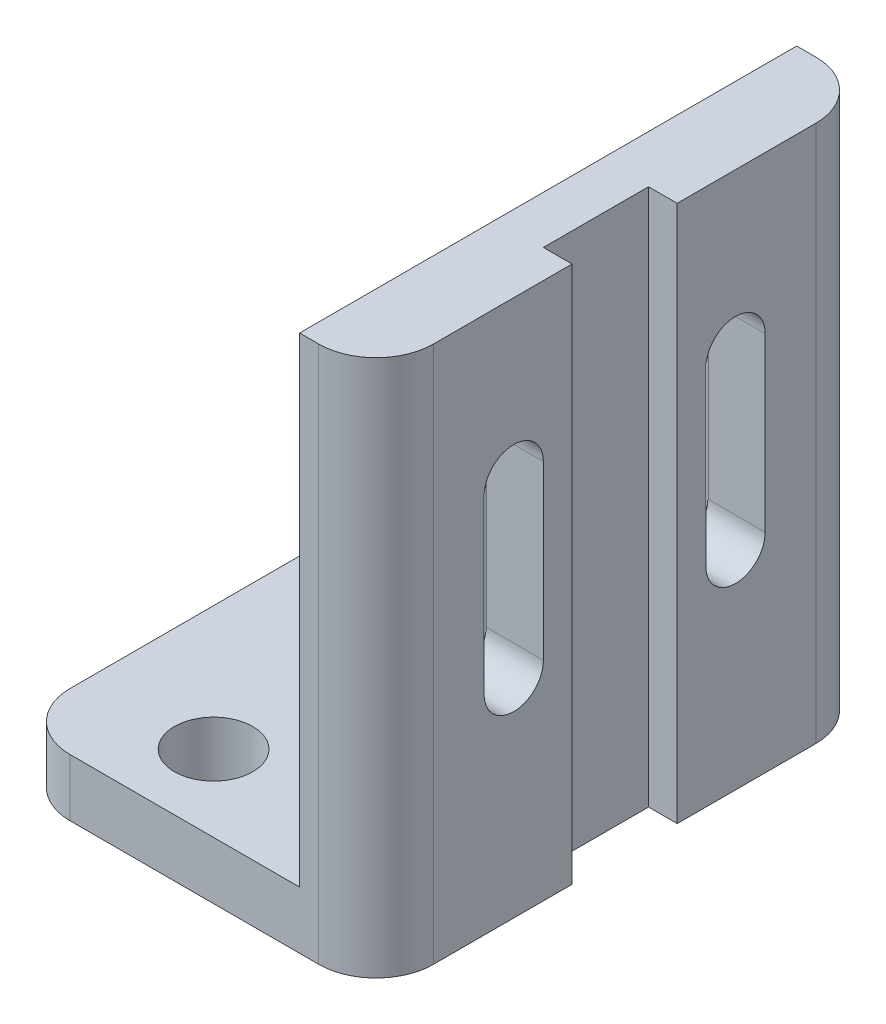
ISO-10303-21;
HEADER;
FILE_DESCRIPTION(('STEP AP214'),'2;1');
FILE_NAME('part.step','',(''),(''),'','','');
FILE_SCHEMA(('AUTOMOTIVE_DESIGN { 1 0 10303 214 1 1 1 1 }'));
ENDSEC;
DATA;
#1=APPLICATION_CONTEXT('core data for automotive mechanical design processes');
#2=APPLICATION_PROTOCOL_DEFINITION('international standard','automotive_design',2000,#1);
#3=PRODUCT_CONTEXT('',#1,'mechanical');
#4=PRODUCT('Part','Part','',(#3));
#5=PRODUCT_RELATED_PRODUCT_CATEGORY('part','',(#4));
#6=PRODUCT_DEFINITION_FORMATION('','',#4);
#7=PRODUCT_DEFINITION_CONTEXT('part definition',#1,'design');
#8=PRODUCT_DEFINITION('design','',#6,#7);
#9=PRODUCT_DEFINITION_SHAPE('','',#8);
#10=(LENGTH_UNIT() NAMED_UNIT(*) SI_UNIT(.MILLI.,.METRE.));
#11=(NAMED_UNIT(*) PLANE_ANGLE_UNIT() SI_UNIT($,.RADIAN.));
#12=(NAMED_UNIT(*) SI_UNIT($,.STERADIAN.) SOLID_ANGLE_UNIT());
#13=UNCERTAINTY_MEASURE_WITH_UNIT(LENGTH_MEASURE(1.E-05),#10,'distance_accuracy_value','');
#14=(GEOMETRIC_REPRESENTATION_CONTEXT(3) GLOBAL_UNCERTAINTY_ASSIGNED_CONTEXT((#13)) GLOBAL_UNIT_ASSIGNED_CONTEXT((#10,
#11,#12)) REPRESENTATION_CONTEXT('',''));
#15=CARTESIAN_POINT('',(0.,0.,0.));
#16=DIRECTION('',(0.,0.,1.));
#17=DIRECTION('',(1.,0.,0.));
#18=AXIS2_PLACEMENT_3D('',#15,#16,#17);
#19=CARTESIAN_POINT('',(19.,0.,26.));
#20=DIRECTION('',(-1.,0.,0.));
#21=DIRECTION('',(0.,0.,1.));
#22=AXIS2_PLACEMENT_3D('',#19,#20,#21);
#23=PLANE('',#22);
#24=DIRECTION('',(0.,-1.,0.));
#25=VECTOR('',#24,1.);
#26=CARTESIAN_POINT('',(19.,19.9,17.25));
#27=LINE('',#26,#25);
#28=CARTESIAN_POINT('',(19.,19.9,17.25));
#29=VERTEX_POINT('',#28);
#30=CARTESIAN_POINT('',(19.,10.9,17.25));
#31=VERTEX_POINT('',#30);
#32=EDGE_CURVE('E372',#29,#31,#27,.T.);
#33=ORIENTED_EDGE('',*,*,#32,.T.);
#34=CARTESIAN_POINT('',(19.,10.9,18.8));
#35=DIRECTION('',(-1.,0.,0.));
#36=DIRECTION('',(0.,-1.,0.));
#37=AXIS2_PLACEMENT_3D('',#34,#35,#36);
#38=CIRCLE('',#37,1.55);
#39=CARTESIAN_POINT('',(19.,10.9,20.35));
#40=VERTEX_POINT('',#39);
#41=EDGE_CURVE('E347',#31,#40,#38,.T.);
#42=ORIENTED_EDGE('',*,*,#41,.T.);
#43=DIRECTION('',(0.,1.,0.));
#44=VECTOR('',#43,1.);
#45=CARTESIAN_POINT('',(19.,19.9,20.35));
#46=LINE('',#45,#44);
#47=CARTESIAN_POINT('',(19.,19.9,20.35));
#48=VERTEX_POINT('',#47);
#49=EDGE_CURVE('E386',#40,#48,#46,.T.);
#50=ORIENTED_EDGE('',*,*,#49,.T.);
#51=CARTESIAN_POINT('',(19.,19.9,18.8));
#52=DIRECTION('',(-1.,0.,0.));
#53=DIRECTION('',(0.,-1.,0.));
#54=AXIS2_PLACEMENT_3D('',#51,#52,#53);
#55=CIRCLE('',#54,1.55);
#56=EDGE_CURVE('E383',#48,#29,#55,.T.);
#57=ORIENTED_EDGE('',*,*,#56,.T.);
#58=EDGE_LOOP('',(#33,#42,#50,#57));
#59=FACE_BOUND('',#58,.T.);
#60=DIRECTION('',(0.,0.,-1.));
#61=VECTOR('',#60,1.);
#62=CARTESIAN_POINT('',(19.,0.,26.));
#63=LINE('',#62,#61);
#64=CARTESIAN_POINT('',(19.,0.,23.));
#65=VERTEX_POINT('',#64);
#66=CARTESIAN_POINT('',(19.,0.,15.75));
#67=VERTEX_POINT('',#66);
#68=EDGE_CURVE('E436',#65,#67,#63,.T.);
#69=ORIENTED_EDGE('',*,*,#68,.T.);
#70=DIRECTION('',(0.,-1.,0.));
#71=VECTOR('',#70,1.);
#72=CARTESIAN_POINT('',(19.,28.1,15.75));
#73=LINE('',#72,#71);
#74=CARTESIAN_POINT('',(19.,28.1,15.75));
#75=VERTEX_POINT('',#74);
#76=EDGE_CURVE('E239',#75,#67,#73,.T.);
#77=ORIENTED_EDGE('',*,*,#76,.F.);
#78=DIRECTION('',(0.,0.,-1.));
#79=VECTOR('',#78,1.);
#80=CARTESIAN_POINT('',(19.,28.1,26.));
#81=LINE('',#80,#79);
#82=CARTESIAN_POINT('',(19.,28.1,23.));
#83=VERTEX_POINT('',#82);
#84=EDGE_CURVE('E432',#83,#75,#81,.T.);
#85=ORIENTED_EDGE('',*,*,#84,.F.);
#86=DIRECTION('',(0.,1.,0.));
#87=VECTOR('',#86,1.);
#88=CARTESIAN_POINT('',(19.,0.,23.));
#89=LINE('',#88,#87);
#90=EDGE_CURVE('E454',#83,#65,#89,.F.);
#91=ORIENTED_EDGE('',*,*,#90,.T.);
#92=EDGE_LOOP('',(#69,#77,#85,#91));
#93=FACE_BOUND('',#92,.T.);
#94=ADVANCED_FACE('F38',(#59,#93),#23,.F.);
#95=CARTESIAN_POINT('',(19.,10.9,18.8));
#96=DIRECTION('',(-1.,0.,0.));
#97=DIRECTION('',(0.,-1.,0.));
#98=AXIS2_PLACEMENT_3D('',#95,#96,#97);
#99=CYLINDRICAL_SURFACE('',#98,1.55);
#100=CARTESIAN_POINT('',(16.,10.9,18.8));
#101=DIRECTION('',(-1.,0.,0.));
#102=DIRECTION('',(0.,-1.,0.));
#103=AXIS2_PLACEMENT_3D('',#100,#101,#102);
#104=CIRCLE('',#103,1.55);
#105=CARTESIAN_POINT('',(16.,10.9,20.35));
#106=VERTEX_POINT('',#105);
#107=CARTESIAN_POINT('',(16.,10.9,17.25));
#108=VERTEX_POINT('',#107);
#109=EDGE_CURVE('E340',#106,#108,#104,.F.);
#110=ORIENTED_EDGE('',*,*,#109,.F.);
#111=DIRECTION('',(-1.,0.,0.));
#112=VECTOR('',#111,1.);
#113=CARTESIAN_POINT('',(19.,10.9,20.35));
#114=LINE('',#113,#112);
#115=EDGE_CURVE('E369',#40,#106,#114,.T.);
#116=ORIENTED_EDGE('',*,*,#115,.F.);
#117=ORIENTED_EDGE('',*,*,#41,.F.);
#118=DIRECTION('',(-1.,0.,0.));
#119=VECTOR('',#118,1.);
#120=CARTESIAN_POINT('',(19.,10.9,17.25));
#121=LINE('',#120,#119);
#122=EDGE_CURVE('E342',#31,#108,#121,.T.);
#123=ORIENTED_EDGE('',*,*,#122,.T.);
#124=EDGE_LOOP('',(#110,#116,#117,#123));
#125=FACE_BOUND('',#124,.T.);
#126=ADVANCED_FACE('F508',(#125),#99,.F.);
#127=CARTESIAN_POINT('',(19.,19.9,17.25));
#128=DIRECTION('',(0.,0.,-1.));
#129=DIRECTION('',(0.,1.,0.));
#130=AXIS2_PLACEMENT_3D('',#127,#128,#129);
#131=PLANE('',#130);
#132=DIRECTION('',(0.,1.,0.));
#133=VECTOR('',#132,1.);
#134=CARTESIAN_POINT('',(16.,19.9,17.25));
#135=LINE('',#134,#133);
#136=CARTESIAN_POINT('',(16.,19.9,17.25));
#137=VERTEX_POINT('',#136);
#138=EDGE_CURVE('E338',#108,#137,#135,.T.);
#139=ORIENTED_EDGE('',*,*,#138,.F.);
#140=ORIENTED_EDGE('',*,*,#122,.F.);
#141=ORIENTED_EDGE('',*,*,#32,.F.);
#142=DIRECTION('',(-1.,0.,0.));
#143=VECTOR('',#142,1.);
#144=CARTESIAN_POINT('',(19.,19.9,17.25));
#145=LINE('',#144,#143);
#146=EDGE_CURVE('E376',#29,#137,#145,.T.);
#147=ORIENTED_EDGE('',*,*,#146,.T.);
#148=EDGE_LOOP('',(#139,#140,#141,#147));
#149=FACE_BOUND('',#148,.T.);
#150=ADVANCED_FACE('F516',(#149),#131,.F.);
#151=CARTESIAN_POINT('',(19.,19.9,18.8));
#152=DIRECTION('',(-1.,0.,0.));
#153=DIRECTION('',(0.,-1.,0.));
#154=AXIS2_PLACEMENT_3D('',#151,#152,#153);
#155=CYLINDRICAL_SURFACE('',#154,1.55);
#156=CARTESIAN_POINT('',(16.,19.9,18.8));
#157=DIRECTION('',(-1.,0.,0.));
#158=DIRECTION('',(0.,-1.,0.));
#159=AXIS2_PLACEMENT_3D('',#156,#157,#158);
#160=CIRCLE('',#159,1.55);
#161=CARTESIAN_POINT('',(16.,19.9,20.35));
#162=VERTEX_POINT('',#161);
#163=EDGE_CURVE('E336',#137,#162,#160,.F.);
#164=ORIENTED_EDGE('',*,*,#163,.F.);
#165=ORIENTED_EDGE('',*,*,#146,.F.);
#166=ORIENTED_EDGE('',*,*,#56,.F.);
#167=DIRECTION('',(-1.,0.,0.));
#168=VECTOR('',#167,1.);
#169=CARTESIAN_POINT('',(19.,19.9,20.35));
#170=LINE('',#169,#168);
#171=EDGE_CURVE('E373',#48,#162,#170,.T.);
#172=ORIENTED_EDGE('',*,*,#171,.T.);
#173=EDGE_LOOP('',(#164,#165,#166,#172));
#174=FACE_BOUND('',#173,.T.);
#175=ADVANCED_FACE('F648',(#174),#155,.F.);
#176=CARTESIAN_POINT('',(19.,19.9,20.35));
#177=DIRECTION('',(0.,0.,1.));
#178=DIRECTION('',(0.,-1.,0.));
#179=AXIS2_PLACEMENT_3D('',#176,#177,#178);
#180=PLANE('',#179);
#181=DIRECTION('',(0.,-1.,0.));
#182=VECTOR('',#181,1.);
#183=CARTESIAN_POINT('',(16.,19.9,20.35));
#184=LINE('',#183,#182);
#185=EDGE_CURVE('E11',#162,#106,#184,.T.);
#186=ORIENTED_EDGE('',*,*,#185,.F.);
#187=ORIENTED_EDGE('',*,*,#171,.F.);
#188=ORIENTED_EDGE('',*,*,#49,.F.);
#189=ORIENTED_EDGE('',*,*,#115,.T.);
#190=EDGE_LOOP('',(#186,#187,#188,#189));
#191=FACE_BOUND('',#190,.T.);
#192=ADVANCED_FACE('F650',(#191),#180,.F.);
#193=CARTESIAN_POINT('',(19.,10.9,7.2));
#194=DIRECTION('',(-1.,0.,0.));
#195=DIRECTION('',(0.,-1.,0.));
#196=AXIS2_PLACEMENT_3D('',#193,#194,#195);
#197=CYLINDRICAL_SURFACE('',#196,1.55);
#198=CARTESIAN_POINT('',(16.,10.9,7.2));
#199=DIRECTION('',(-1.,0.,0.));
#200=DIRECTION('',(0.,-1.,0.));
#201=AXIS2_PLACEMENT_3D('',#198,#199,#200);
#202=CIRCLE('',#201,1.55);
#203=CARTESIAN_POINT('',(16.,10.9,8.75));
#204=VERTEX_POINT('',#203);
#205=CARTESIAN_POINT('',(16.,10.9,5.65));
#206=VERTEX_POINT('',#205);
#207=EDGE_CURVE('E334',#204,#206,#202,.F.);
#208=ORIENTED_EDGE('',*,*,#207,.F.);
#209=DIRECTION('',(-1.,0.,0.));
#210=VECTOR('',#209,1.);
#211=CARTESIAN_POINT('',(19.,10.9,8.75));
#212=LINE('',#211,#210);
#213=CARTESIAN_POINT('',(19.,10.9,8.75));
#214=VERTEX_POINT('',#213);
#215=EDGE_CURVE('E356',#214,#204,#212,.T.);
#216=ORIENTED_EDGE('',*,*,#215,.F.);
#217=CARTESIAN_POINT('',(19.,10.9,7.2));
#218=DIRECTION('',(-1.,0.,0.));
#219=DIRECTION('',(0.,-1.,0.));
#220=AXIS2_PLACEMENT_3D('',#217,#218,#219);
#221=CIRCLE('',#220,1.55);
#222=CARTESIAN_POINT('',(19.,10.9,5.65));
#223=VERTEX_POINT('',#222);
#224=EDGE_CURVE('E343',#223,#214,#221,.T.);
#225=ORIENTED_EDGE('',*,*,#224,.F.);
#226=DIRECTION('',(-1.,0.,0.));
#227=VECTOR('',#226,1.);
#228=CARTESIAN_POINT('',(19.,10.9,5.65));
#229=LINE('',#228,#227);
#230=EDGE_CURVE('E357',#223,#206,#229,.T.);
#231=ORIENTED_EDGE('',*,*,#230,.T.);
#232=EDGE_LOOP('',(#208,#216,#225,#231));
#233=FACE_BOUND('',#232,.T.);
#234=ADVANCED_FACE('F486',(#233),#197,.F.);
#235=CARTESIAN_POINT('',(19.,19.9,5.65));
#236=DIRECTION('',(0.,0.,-1.));
#237=DIRECTION('',(0.,1.,0.));
#238=AXIS2_PLACEMENT_3D('',#235,#236,#237);
#239=PLANE('',#238);
#240=DIRECTION('',(0.,1.,0.));
#241=VECTOR('',#240,1.);
#242=CARTESIAN_POINT('',(16.,19.9,5.65));
#243=LINE('',#242,#241);
#244=CARTESIAN_POINT('',(16.,19.9,5.65));
#245=VERTEX_POINT('',#244);
#246=EDGE_CURVE('E332',#206,#245,#243,.T.);
#247=ORIENTED_EDGE('',*,*,#246,.F.);
#248=ORIENTED_EDGE('',*,*,#230,.F.);
#249=DIRECTION('',(0.,-1.,0.));
#250=VECTOR('',#249,1.);
#251=CARTESIAN_POINT('',(19.,19.9,5.65));
#252=LINE('',#251,#250);
#253=CARTESIAN_POINT('',(19.,19.9,5.65));
#254=VERTEX_POINT('',#253);
#255=EDGE_CURVE('E353',#254,#223,#252,.T.);
#256=ORIENTED_EDGE('',*,*,#255,.F.);
#257=DIRECTION('',(-1.,0.,0.));
#258=VECTOR('',#257,1.);
#259=CARTESIAN_POINT('',(19.,19.9,5.65));
#260=LINE('',#259,#258);
#261=EDGE_CURVE('E361',#254,#245,#260,.T.);
#262=ORIENTED_EDGE('',*,*,#261,.T.);
#263=EDGE_LOOP('',(#247,#248,#256,#262));
#264=FACE_BOUND('',#263,.T.);
#265=ADVANCED_FACE('F495',(#264),#239,.F.);
#266=CARTESIAN_POINT('',(19.,19.9,7.2));
#267=DIRECTION('',(-1.,0.,0.));
#268=DIRECTION('',(0.,-1.,0.));
#269=AXIS2_PLACEMENT_3D('',#266,#267,#268);
#270=CYLINDRICAL_SURFACE('',#269,1.55);
#271=CARTESIAN_POINT('',(16.,19.9,7.2));
#272=DIRECTION('',(-1.,0.,0.));
#273=DIRECTION('',(0.,-1.,0.));
#274=AXIS2_PLACEMENT_3D('',#271,#272,#273);
#275=CIRCLE('',#274,1.55);
#276=CARTESIAN_POINT('',(16.,19.9,8.75));
#277=VERTEX_POINT('',#276);
#278=EDGE_CURVE('E295',#245,#277,#275,.F.);
#279=ORIENTED_EDGE('',*,*,#278,.F.);
#280=ORIENTED_EDGE('',*,*,#261,.F.);
#281=CARTESIAN_POINT('',(19.,19.9,7.2));
#282=DIRECTION('',(-1.,0.,0.));
#283=DIRECTION('',(0.,-1.,0.));
#284=AXIS2_PLACEMENT_3D('',#281,#282,#283);
#285=CIRCLE('',#284,1.55);
#286=CARTESIAN_POINT('',(19.,19.9,8.75));
#287=VERTEX_POINT('',#286);
#288=EDGE_CURVE('E350',#287,#254,#285,.T.);
#289=ORIENTED_EDGE('',*,*,#288,.F.);
#290=DIRECTION('',(-1.,0.,0.));
#291=VECTOR('',#290,1.);
#292=CARTESIAN_POINT('',(19.,19.9,8.75));
#293=LINE('',#292,#291);
#294=EDGE_CURVE('E364',#287,#277,#293,.T.);
#295=ORIENTED_EDGE('',*,*,#294,.T.);
#296=EDGE_LOOP('',(#279,#280,#289,#295));
#297=FACE_BOUND('',#296,.T.);
#298=ADVANCED_FACE('F497',(#297),#270,.F.);
#299=CARTESIAN_POINT('',(19.,19.9,8.75));
#300=DIRECTION('',(0.,0.,1.));
#301=DIRECTION('',(0.,-1.,0.));
#302=AXIS2_PLACEMENT_3D('',#299,#300,#301);
#303=PLANE('',#302);
#304=DIRECTION('',(0.,-1.,0.));
#305=VECTOR('',#304,1.);
#306=CARTESIAN_POINT('',(16.,19.9,8.75));
#307=LINE('',#306,#305);
#308=EDGE_CURVE('E46',#277,#204,#307,.T.);
#309=ORIENTED_EDGE('',*,*,#308,.F.);
#310=ORIENTED_EDGE('',*,*,#294,.F.);
#311=DIRECTION('',(0.,1.,0.));
#312=VECTOR('',#311,1.);
#313=CARTESIAN_POINT('',(19.,19.9,8.75));
#314=LINE('',#313,#312);
#315=EDGE_CURVE('E346',#214,#287,#314,.T.);
#316=ORIENTED_EDGE('',*,*,#315,.F.);
#317=ORIENTED_EDGE('',*,*,#215,.T.);
#318=EDGE_LOOP('',(#309,#310,#316,#317));
#319=FACE_BOUND('',#318,.T.);
#320=ADVANCED_FACE('F489',(#319),#303,.F.);
#321=CARTESIAN_POINT('',(0.,3.,26.));
#322=DIRECTION('',(1.,0.,0.));
#323=DIRECTION('',(0.,1.,0.));
#324=AXIS2_PLACEMENT_3D('',#321,#322,#323);
#325=PLANE('',#324);
#326=DIRECTION('',(0.,0.,-1.));
#327=VECTOR('',#326,1.);
#328=CARTESIAN_POINT('',(0.,3.,26.));
#329=LINE('',#328,#327);
#330=CARTESIAN_POINT('',(0.,3.,23.));
#331=VERTEX_POINT('',#330);
#332=CARTESIAN_POINT('',(0.,3.,3.00000000000001));
#333=VERTEX_POINT('',#332);
#334=EDGE_CURVE('E414',#331,#333,#329,.T.);
#335=ORIENTED_EDGE('',*,*,#334,.T.);
#336=DIRECTION('',(0.,-1.,0.));
#337=VECTOR('',#336,1.);
#338=CARTESIAN_POINT('',(0.,3.,3.));
#339=LINE('',#338,#337);
#340=CARTESIAN_POINT('',(0.,0.,3.00000000000001));
#341=VERTEX_POINT('',#340);
#342=EDGE_CURVE('E471',#333,#341,#339,.T.);
#343=ORIENTED_EDGE('',*,*,#342,.T.);
#344=DIRECTION('',(0.,0.,-1.));
#345=VECTOR('',#344,1.);
#346=CARTESIAN_POINT('',(0.,0.,26.));
#347=LINE('',#346,#345);
#348=CARTESIAN_POINT('',(0.,0.,23.));
#349=VERTEX_POINT('',#348);
#350=EDGE_CURVE('E438',#349,#341,#347,.T.);
#351=ORIENTED_EDGE('',*,*,#350,.F.);
#352=DIRECTION('',(0.,-1.,0.));
#353=VECTOR('',#352,1.);
#354=CARTESIAN_POINT('',(0.,3.,23.));
#355=LINE('',#354,#353);
#356=EDGE_CURVE('E469',#349,#331,#355,.F.);
#357=ORIENTED_EDGE('',*,*,#356,.T.);
#358=EDGE_LOOP('',(#335,#343,#351,#357));
#359=FACE_BOUND('',#358,.T.);
#360=ADVANCED_FACE('F504',(#359),#325,.F.);
#361=CARTESIAN_POINT('',(0.,0.,26.));
#362=DIRECTION('',(0.,1.,0.));
#363=DIRECTION('',(0.,0.,1.));
#364=AXIS2_PLACEMENT_3D('',#361,#362,#363);
#365=PLANE('',#364);
#366=CARTESIAN_POINT('',(6.5,0.,4.));
#367=DIRECTION('',(0.,1.,0.));
#368=DIRECTION('',(-1.,0.,0.));
#369=AXIS2_PLACEMENT_3D('',#366,#367,#368);
#370=CIRCLE('',#369,2.05);
#371=CARTESIAN_POINT('',(4.45,0.,4.));
#372=VERTEX_POINT('',#371);
#373=EDGE_CURVE('E391',#372,#372,#370,.T.);
#374=ORIENTED_EDGE('',*,*,#373,.T.);
#375=EDGE_LOOP('',(#374));
#376=FACE_BOUND('',#375,.T.);
#377=CARTESIAN_POINT('',(6.5,0.,22.));
#378=DIRECTION('',(0.,1.,0.));
#379=DIRECTION('',(-1.,0.,0.));
#380=AXIS2_PLACEMENT_3D('',#377,#378,#379);
#381=CIRCLE('',#380,2.05);
#382=CARTESIAN_POINT('',(4.45,0.,22.));
#383=VERTEX_POINT('',#382);
#384=EDGE_CURVE('E360',#383,#383,#381,.T.);
#385=ORIENTED_EDGE('',*,*,#384,.T.);
#386=EDGE_LOOP('',(#385));
#387=FACE_BOUND('',#386,.T.);
#388=DIRECTION('',(0.,0.,-1.));
#389=VECTOR('',#388,1.);
#390=CARTESIAN_POINT('',(17.5,0.,15.75));
#391=LINE('',#390,#389);
#392=CARTESIAN_POINT('',(17.5,0.,15.75));
#393=VERTEX_POINT('',#392);
#394=CARTESIAN_POINT('',(17.5,0.,10.25));
#395=VERTEX_POINT('',#394);
#396=EDGE_CURVE('E248',#393,#395,#391,.T.);
#397=ORIENTED_EDGE('',*,*,#396,.F.);
#398=DIRECTION('',(1.,0.,0.));
#399=VECTOR('',#398,1.);
#400=CARTESIAN_POINT('',(17.5,0.,15.75));
#401=LINE('',#400,#399);
#402=EDGE_CURVE('E234',#393,#67,#401,.T.);
#403=ORIENTED_EDGE('',*,*,#402,.T.);
#404=ORIENTED_EDGE('',*,*,#68,.F.);
#405=CARTESIAN_POINT('',(16.,0.,23.));
#406=DIRECTION('',(0.,1.,0.));
#407=DIRECTION('',(0.,0.,1.));
#408=AXIS2_PLACEMENT_3D('',#405,#406,#407);
#409=CIRCLE('',#408,3.);
#410=CARTESIAN_POINT('',(16.,0.,26.));
#411=VERTEX_POINT('',#410);
#412=EDGE_CURVE('E463',#65,#411,#409,.F.);
#413=ORIENTED_EDGE('',*,*,#412,.T.);
#414=DIRECTION('',(1.,0.,0.));
#415=VECTOR('',#414,1.);
#416=CARTESIAN_POINT('',(0.,0.,26.));
#417=LINE('',#416,#415);
#418=CARTESIAN_POINT('',(3.,0.,26.));
#419=VERTEX_POINT('',#418);
#420=EDGE_CURVE('E403',#419,#411,#417,.T.);
#421=ORIENTED_EDGE('',*,*,#420,.F.);
#422=CARTESIAN_POINT('',(3.,0.,23.));
#423=DIRECTION('',(0.,1.,0.));
#424=DIRECTION('',(0.,0.,1.));
#425=AXIS2_PLACEMENT_3D('',#422,#423,#424);
#426=CIRCLE('',#425,3.);
#427=EDGE_CURVE('E456',#419,#349,#426,.F.);
#428=ORIENTED_EDGE('',*,*,#427,.T.);
#429=ORIENTED_EDGE('',*,*,#350,.T.);
#430=CARTESIAN_POINT('',(3.,0.,3.));
#431=DIRECTION('',(0.,1.,0.));
#432=DIRECTION('',(0.,0.,1.));
#433=AXIS2_PLACEMENT_3D('',#430,#431,#432);
#434=CIRCLE('',#433,3.);
#435=CARTESIAN_POINT('',(3.,0.,0.));
#436=VERTEX_POINT('',#435);
#437=EDGE_CURVE('E458',#341,#436,#434,.F.);
#438=ORIENTED_EDGE('',*,*,#437,.T.);
#439=DIRECTION('',(1.,0.,0.));
#440=VECTOR('',#439,1.);
#441=CARTESIAN_POINT('',(0.,0.,0.));
#442=LINE('',#441,#440);
#443=CARTESIAN_POINT('',(16.,0.,0.));
#444=VERTEX_POINT('',#443);
#445=EDGE_CURVE('E394',#436,#444,#442,.T.);
#446=ORIENTED_EDGE('',*,*,#445,.T.);
#447=CARTESIAN_POINT('',(16.,0.,3.));
#448=DIRECTION('',(0.,1.,0.));
#449=DIRECTION('',(0.,0.,1.));
#450=AXIS2_PLACEMENT_3D('',#447,#448,#449);
#451=CIRCLE('',#450,3.);
#452=CARTESIAN_POINT('',(19.,0.,3.00000000000001));
#453=VERTEX_POINT('',#452);
#454=EDGE_CURVE('E460',#444,#453,#451,.F.);
#455=ORIENTED_EDGE('',*,*,#454,.T.);
#456=CARTESIAN_POINT('',(19.,0.,10.25));
#457=VERTEX_POINT('',#456);
#458=EDGE_CURVE('E435',#457,#453,#63,.T.);
#459=ORIENTED_EDGE('',*,*,#458,.F.);
#460=DIRECTION('',(1.,0.,0.));
#461=VECTOR('',#460,1.);
#462=CARTESIAN_POINT('',(17.5,0.,10.25));
#463=LINE('',#462,#461);
#464=EDGE_CURVE('E244',#395,#457,#463,.T.);
#465=ORIENTED_EDGE('',*,*,#464,.F.);
#466=EDGE_LOOP('',(#397,#403,#404,#413,#421,#428,#429,#438,#446,#455,#459,#465));
#467=FACE_BOUND('',#466,.T.);
#468=ADVANCED_FACE('F254',(#376,#387,#467),#365,.F.);
#469=ORIENTED_EDGE('',*,*,#255,.T.);
#470=ORIENTED_EDGE('',*,*,#224,.T.);
#471=ORIENTED_EDGE('',*,*,#315,.T.);
#472=ORIENTED_EDGE('',*,*,#288,.T.);
#473=EDGE_LOOP('',(#469,#470,#471,#472));
#474=FACE_BOUND('',#473,.T.);
#475=CARTESIAN_POINT('',(19.,28.1,10.25));
#476=VERTEX_POINT('',#475);
#477=CARTESIAN_POINT('',(19.,28.1,3.00000000000001));
#478=VERTEX_POINT('',#477);
#479=EDGE_CURVE('E431',#476,#478,#81,.T.);
#480=ORIENTED_EDGE('',*,*,#479,.F.);
#481=DIRECTION('',(0.,1.,0.));
#482=VECTOR('',#481,1.);
#483=CARTESIAN_POINT('',(19.,28.1,10.25));
#484=LINE('',#483,#482);
#485=EDGE_CURVE('E252',#457,#476,#484,.T.);
#486=ORIENTED_EDGE('',*,*,#485,.F.);
#487=ORIENTED_EDGE('',*,*,#458,.T.);
#488=DIRECTION('',(0.,1.,0.));
#489=VECTOR('',#488,1.);
#490=CARTESIAN_POINT('',(19.,0.,3.));
#491=LINE('',#490,#489);
#492=EDGE_CURVE('E451',#453,#478,#491,.T.);
#493=ORIENTED_EDGE('',*,*,#492,.T.);
#494=EDGE_LOOP('',(#480,#486,#487,#493));
#495=FACE_BOUND('',#494,.T.);
#496=ADVANCED_FACE('F491',(#474,#495),#23,.F.);
#497=CARTESIAN_POINT('',(19.,28.1,26.));
#498=DIRECTION('',(0.,-1.,0.));
#499=DIRECTION('',(0.,0.,-1.));
#500=AXIS2_PLACEMENT_3D('',#497,#498,#499);
#501=PLANE('',#500);
#502=ORIENTED_EDGE('',*,*,#84,.T.);
#503=DIRECTION('',(1.,0.,0.));
#504=VECTOR('',#503,1.);
#505=CARTESIAN_POINT('',(17.5,28.1,15.75));
#506=LINE('',#505,#504);
#507=CARTESIAN_POINT('',(17.5,28.1,15.75));
#508=VERTEX_POINT('',#507);
#509=EDGE_CURVE('E262',#508,#75,#506,.T.);
#510=ORIENTED_EDGE('',*,*,#509,.F.);
#511=DIRECTION('',(0.,0.,1.));
#512=VECTOR('',#511,1.);
#513=CARTESIAN_POINT('',(17.5,28.1,15.75));
#514=LINE('',#513,#512);
#515=CARTESIAN_POINT('',(17.5,28.1,10.25));
#516=VERTEX_POINT('',#515);
#517=EDGE_CURVE('E245',#516,#508,#514,.T.);
#518=ORIENTED_EDGE('',*,*,#517,.F.);
#519=DIRECTION('',(1.,0.,0.));
#520=VECTOR('',#519,1.);
#521=CARTESIAN_POINT('',(17.5,28.1,10.25));
#522=LINE('',#521,#520);
#523=EDGE_CURVE('E265',#516,#476,#522,.T.);
#524=ORIENTED_EDGE('',*,*,#523,.T.);
#525=ORIENTED_EDGE('',*,*,#479,.T.);
#526=CARTESIAN_POINT('',(16.,28.1,3.));
#527=DIRECTION('',(0.,-1.,0.));
#528=DIRECTION('',(0.,0.,-1.));
#529=AXIS2_PLACEMENT_3D('',#526,#527,#528);
#530=CIRCLE('',#529,3.);
#531=CARTESIAN_POINT('',(16.,28.1,0.));
#532=VERTEX_POINT('',#531);
#533=EDGE_CURVE('E447',#478,#532,#530,.F.);
#534=ORIENTED_EDGE('',*,*,#533,.T.);
#535=DIRECTION('',(-1.,0.,0.));
#536=VECTOR('',#535,1.);
#537=CARTESIAN_POINT('',(19.,28.1,0.));
#538=LINE('',#537,#536);
#539=CARTESIAN_POINT('',(15.,28.1,0.));
#540=VERTEX_POINT('',#539);
#541=EDGE_CURVE('E417',#532,#540,#538,.T.);
#542=ORIENTED_EDGE('',*,*,#541,.T.);
#543=DIRECTION('',(0.,0.,-1.));
#544=VECTOR('',#543,1.);
#545=CARTESIAN_POINT('',(15.,28.1,26.));
#546=LINE('',#545,#544);
#547=CARTESIAN_POINT('',(15.,28.1,26.));
#548=VERTEX_POINT('',#547);
#549=EDGE_CURVE('E428',#548,#540,#546,.T.);
#550=ORIENTED_EDGE('',*,*,#549,.F.);
#551=DIRECTION('',(-1.,0.,0.));
#552=VECTOR('',#551,1.);
#553=CARTESIAN_POINT('',(19.,28.1,26.));
#554=LINE('',#553,#552);
#555=CARTESIAN_POINT('',(16.,28.1,26.));
#556=VERTEX_POINT('',#555);
#557=EDGE_CURVE('E406',#556,#548,#554,.T.);
#558=ORIENTED_EDGE('',*,*,#557,.F.);
#559=CARTESIAN_POINT('',(16.,28.1,23.));
#560=DIRECTION('',(0.,-1.,0.));
#561=DIRECTION('',(0.,0.,-1.));
#562=AXIS2_PLACEMENT_3D('',#559,#560,#561);
#563=CIRCLE('',#562,3.);
#564=EDGE_CURVE('E449',#556,#83,#563,.F.);
#565=ORIENTED_EDGE('',*,*,#564,.T.);
#566=EDGE_LOOP('',(#502,#510,#518,#524,#525,#534,#542,#550,#558,#565));
#567=FACE_BOUND('',#566,.T.);
#568=ADVANCED_FACE('F523',(#567),#501,.F.);
#569=CARTESIAN_POINT('',(15.,28.1,26.));
#570=DIRECTION('',(1.,0.,0.));
#571=DIRECTION('',(0.,1.,0.));
#572=AXIS2_PLACEMENT_3D('',#569,#570,#571);
#573=PLANE('',#572);
#574=DIRECTION('',(0.,-1.,0.));
#575=VECTOR('',#574,1.);
#576=CARTESIAN_POINT('',(15.,19.9,4.));
#577=LINE('',#576,#575);
#578=CARTESIAN_POINT('',(15.,19.9,4.));
#579=VERTEX_POINT('',#578);
#580=CARTESIAN_POINT('',(15.,10.9,4.));
#581=VERTEX_POINT('',#580);
#582=EDGE_CURVE('E284',#579,#581,#577,.T.);
#583=ORIENTED_EDGE('',*,*,#582,.F.);
#584=CARTESIAN_POINT('',(15.,19.9,7.2));
#585=DIRECTION('',(-1.,0.,0.));
#586=DIRECTION('',(0.,-1.,0.));
#587=AXIS2_PLACEMENT_3D('',#584,#585,#586);
#588=CIRCLE('',#587,3.2);
#589=CARTESIAN_POINT('',(15.,19.9,10.4));
#590=VERTEX_POINT('',#589);
#591=EDGE_CURVE('E61',#590,#579,#588,.T.);
#592=ORIENTED_EDGE('',*,*,#591,.F.);
#593=DIRECTION('',(0.,1.,0.));
#594=VECTOR('',#593,1.);
#595=CARTESIAN_POINT('',(15.,19.9,10.4));
#596=LINE('',#595,#594);
#597=CARTESIAN_POINT('',(15.,10.9,10.4));
#598=VERTEX_POINT('',#597);
#599=EDGE_CURVE('E273',#598,#590,#596,.T.);
#600=ORIENTED_EDGE('',*,*,#599,.F.);
#601=CARTESIAN_POINT('',(15.,10.9,7.2));
#602=DIRECTION('',(-1.,0.,0.));
#603=DIRECTION('',(0.,-1.,0.));
#604=AXIS2_PLACEMENT_3D('',#601,#602,#603);
#605=CIRCLE('',#604,3.2);
#606=EDGE_CURVE('E288',#581,#598,#605,.T.);
#607=ORIENTED_EDGE('',*,*,#606,.F.);
#608=EDGE_LOOP('',(#583,#592,#600,#607));
#609=FACE_BOUND('',#608,.T.);
#610=DIRECTION('',(0.,-1.,0.));
#611=VECTOR('',#610,1.);
#612=CARTESIAN_POINT('',(15.,19.9,15.6));
#613=LINE('',#612,#611);
#614=CARTESIAN_POINT('',(15.,19.9,15.6));
#615=VERTEX_POINT('',#614);
#616=CARTESIAN_POINT('',(15.,10.9,15.6));
#617=VERTEX_POINT('',#616);
#618=EDGE_CURVE('E317',#615,#617,#613,.T.);
#619=ORIENTED_EDGE('',*,*,#618,.F.);
#620=CARTESIAN_POINT('',(15.,19.9,18.8));
#621=DIRECTION('',(-1.,0.,0.));
#622=DIRECTION('',(0.,-1.,0.));
#623=AXIS2_PLACEMENT_3D('',#620,#621,#622);
#624=CIRCLE('',#623,3.2);
#625=CARTESIAN_POINT('',(15.,19.9,22.));
#626=VERTEX_POINT('',#625);
#627=EDGE_CURVE('E285',#626,#615,#624,.T.);
#628=ORIENTED_EDGE('',*,*,#627,.F.);
#629=DIRECTION('',(0.,1.,0.));
#630=VECTOR('',#629,1.);
#631=CARTESIAN_POINT('',(15.,19.9,22.));
#632=LINE('',#631,#630);
#633=CARTESIAN_POINT('',(15.,10.9,22.));
#634=VERTEX_POINT('',#633);
#635=EDGE_CURVE('E310',#634,#626,#632,.T.);
#636=ORIENTED_EDGE('',*,*,#635,.F.);
#637=CARTESIAN_POINT('',(15.,10.9,18.8));
#638=DIRECTION('',(-1.,0.,0.));
#639=DIRECTION('',(0.,-1.,0.));
#640=AXIS2_PLACEMENT_3D('',#637,#638,#639);
#641=CIRCLE('',#640,3.2);
#642=EDGE_CURVE('E313',#617,#634,#641,.T.);
#643=ORIENTED_EDGE('',*,*,#642,.F.);
#644=EDGE_LOOP('',(#619,#628,#636,#643));
#645=FACE_BOUND('',#644,.T.);
#646=DIRECTION('',(0.,-1.,0.));
#647=VECTOR('',#646,1.);
#648=CARTESIAN_POINT('',(15.,28.1,0.));
#649=LINE('',#648,#647);
#650=CARTESIAN_POINT('',(15.,3.,0.));
#651=VERTEX_POINT('',#650);
#652=EDGE_CURVE('E419',#540,#651,#649,.T.);
#653=ORIENTED_EDGE('',*,*,#652,.T.);
#654=DIRECTION('',(0.,0.,-1.));
#655=VECTOR('',#654,1.);
#656=CARTESIAN_POINT('',(15.,3.,26.));
#657=LINE('',#656,#655);
#658=CARTESIAN_POINT('',(15.,3.,26.));
#659=VERTEX_POINT('',#658);
#660=EDGE_CURVE('E425',#659,#651,#657,.T.);
#661=ORIENTED_EDGE('',*,*,#660,.F.);
#662=DIRECTION('',(0.,-1.,0.));
#663=VECTOR('',#662,1.);
#664=CARTESIAN_POINT('',(15.,28.1,26.));
#665=LINE('',#664,#663);
#666=EDGE_CURVE('E409',#548,#659,#665,.T.);
#667=ORIENTED_EDGE('',*,*,#666,.F.);
#668=ORIENTED_EDGE('',*,*,#549,.T.);
#669=EDGE_LOOP('',(#653,#661,#667,#668));
#670=FACE_BOUND('',#669,.T.);
#671=ADVANCED_FACE('F527',(#609,#645,#670),#573,.F.);
#672=CARTESIAN_POINT('',(15.,3.,26.));
#673=DIRECTION('',(0.,-1.,0.));
#674=DIRECTION('',(1.,0.,0.));
#675=AXIS2_PLACEMENT_3D('',#672,#673,#674);
#676=PLANE('',#675);
#677=CARTESIAN_POINT('',(6.5,3.,4.));
#678=DIRECTION('',(0.,1.,0.));
#679=DIRECTION('',(-1.,0.,0.));
#680=AXIS2_PLACEMENT_3D('',#677,#678,#679);
#681=CIRCLE('',#680,2.05);
#682=CARTESIAN_POINT('',(4.45,3.,4.));
#683=VERTEX_POINT('',#682);
#684=EDGE_CURVE('E395',#683,#683,#681,.T.);
#685=ORIENTED_EDGE('',*,*,#684,.F.);
#686=EDGE_LOOP('',(#685));
#687=FACE_BOUND('',#686,.T.);
#688=CARTESIAN_POINT('',(6.5,3.,22.));
#689=DIRECTION('',(0.,1.,0.));
#690=DIRECTION('',(-1.,0.,0.));
#691=AXIS2_PLACEMENT_3D('',#688,#689,#690);
#692=CIRCLE('',#691,2.05);
#693=CARTESIAN_POINT('',(4.45,3.,22.));
#694=VERTEX_POINT('',#693);
#695=EDGE_CURVE('E398',#694,#694,#692,.T.);
#696=ORIENTED_EDGE('',*,*,#695,.F.);
#697=EDGE_LOOP('',(#696));
#698=FACE_BOUND('',#697,.T.);
#699=DIRECTION('',(-1.,0.,0.));
#700=VECTOR('',#699,1.);
#701=CARTESIAN_POINT('',(15.,3.,0.));
#702=LINE('',#701,#700);
#703=CARTESIAN_POINT('',(3.,3.,0.));
#704=VERTEX_POINT('',#703);
#705=EDGE_CURVE('E407',#651,#704,#702,.T.);
#706=ORIENTED_EDGE('',*,*,#705,.T.);
#707=CARTESIAN_POINT('',(3.,3.,3.));
#708=DIRECTION('',(0.,-1.,0.));
#709=DIRECTION('',(1.,0.,0.));
#710=AXIS2_PLACEMENT_3D('',#707,#708,#709);
#711=CIRCLE('',#710,3.);
#712=EDGE_CURVE('E476',#704,#333,#711,.F.);
#713=ORIENTED_EDGE('',*,*,#712,.T.);
#714=ORIENTED_EDGE('',*,*,#334,.F.);
#715=CARTESIAN_POINT('',(3.,3.,23.));
#716=DIRECTION('',(0.,-1.,0.));
#717=DIRECTION('',(1.,0.,0.));
#718=AXIS2_PLACEMENT_3D('',#715,#716,#717);
#719=CIRCLE('',#718,3.);
#720=CARTESIAN_POINT('',(3.,3.,26.));
#721=VERTEX_POINT('',#720);
#722=EDGE_CURVE('E474',#331,#721,#719,.F.);
#723=ORIENTED_EDGE('',*,*,#722,.T.);
#724=DIRECTION('',(-1.,0.,0.));
#725=VECTOR('',#724,1.);
#726=CARTESIAN_POINT('',(15.,3.,26.));
#727=LINE('',#726,#725);
#728=EDGE_CURVE('E411',#659,#721,#727,.T.);
#729=ORIENTED_EDGE('',*,*,#728,.F.);
#730=ORIENTED_EDGE('',*,*,#660,.T.);
#731=EDGE_LOOP('',(#706,#713,#714,#723,#729,#730));
#732=FACE_BOUND('',#731,.T.);
#733=ADVANCED_FACE('F557',(#687,#698,#732),#676,.F.);
#734=CARTESIAN_POINT('',(0.,0.,26.));
#735=DIRECTION('',(0.,0.,1.));
#736=DIRECTION('',(1.,0.,0.));
#737=AXIS2_PLACEMENT_3D('',#734,#735,#736);
#738=PLANE('',#737);
#739=ORIENTED_EDGE('',*,*,#420,.T.);
#740=DIRECTION('',(0.,1.,0.));
#741=VECTOR('',#740,1.);
#742=CARTESIAN_POINT('',(16.,28.1,26.));
#743=LINE('',#742,#741);
#744=EDGE_CURVE('E444',#411,#556,#743,.T.);
#745=ORIENTED_EDGE('',*,*,#744,.T.);
#746=ORIENTED_EDGE('',*,*,#557,.T.);
#747=ORIENTED_EDGE('',*,*,#666,.T.);
#748=ORIENTED_EDGE('',*,*,#728,.T.);
#749=DIRECTION('',(0.,-1.,0.));
#750=VECTOR('',#749,1.);
#751=CARTESIAN_POINT('',(3.,0.,26.));
#752=LINE('',#751,#750);
#753=EDGE_CURVE('E441',#721,#419,#752,.T.);
#754=ORIENTED_EDGE('',*,*,#753,.T.);
#755=EDGE_LOOP('',(#739,#745,#746,#747,#748,#754));
#756=FACE_BOUND('',#755,.T.);
#757=ADVANCED_FACE('F565',(#756),#738,.T.);
#758=CARTESIAN_POINT('',(0.,0.,0.));
#759=DIRECTION('',(0.,0.,1.));
#760=DIRECTION('',(1.,0.,0.));
#761=AXIS2_PLACEMENT_3D('',#758,#759,#760);
#762=PLANE('',#761);
#763=ORIENTED_EDGE('',*,*,#541,.F.);
#764=DIRECTION('',(0.,1.,0.));
#765=VECTOR('',#764,1.);
#766=CARTESIAN_POINT('',(16.,0.,0.));
#767=LINE('',#766,#765);
#768=EDGE_CURVE('E467',#532,#444,#767,.F.);
#769=ORIENTED_EDGE('',*,*,#768,.T.);
#770=ORIENTED_EDGE('',*,*,#445,.F.);
#771=DIRECTION('',(0.,-1.,0.));
#772=VECTOR('',#771,1.);
#773=CARTESIAN_POINT('',(3.,0.,0.));
#774=LINE('',#773,#772);
#775=EDGE_CURVE('E465',#436,#704,#774,.F.);
#776=ORIENTED_EDGE('',*,*,#775,.T.);
#777=ORIENTED_EDGE('',*,*,#705,.F.);
#778=ORIENTED_EDGE('',*,*,#652,.F.);
#779=EDGE_LOOP('',(#763,#769,#770,#776,#777,#778));
#780=FACE_BOUND('',#779,.T.);
#781=ADVANCED_FACE('F575',(#780),#762,.F.);
#782=CARTESIAN_POINT('',(6.5,0.,22.));
#783=DIRECTION('',(0.,1.,0.));
#784=DIRECTION('',(-1.,0.,0.));
#785=AXIS2_PLACEMENT_3D('',#782,#783,#784);
#786=CYLINDRICAL_SURFACE('',#785,2.05);
#787=ORIENTED_EDGE('',*,*,#384,.F.);
#788=EDGE_LOOP('',(#787));
#789=FACE_BOUND('',#788,.T.);
#790=ORIENTED_EDGE('',*,*,#695,.T.);
#791=EDGE_LOOP('',(#790));
#792=FACE_BOUND('',#791,.T.);
#793=ADVANCED_FACE('F664',(#789,#792),#786,.F.);
#794=CARTESIAN_POINT('',(6.5,0.,4.));
#795=DIRECTION('',(0.,1.,0.));
#796=DIRECTION('',(-1.,0.,0.));
#797=AXIS2_PLACEMENT_3D('',#794,#795,#796);
#798=CYLINDRICAL_SURFACE('',#797,2.05);
#799=ORIENTED_EDGE('',*,*,#373,.F.);
#800=EDGE_LOOP('',(#799));
#801=FACE_BOUND('',#800,.T.);
#802=ORIENTED_EDGE('',*,*,#684,.T.);
#803=EDGE_LOOP('',(#802));
#804=FACE_BOUND('',#803,.T.);
#805=ADVANCED_FACE('F541',(#801,#804),#798,.F.);
#806=CARTESIAN_POINT('',(16.,0.,23.));
#807=DIRECTION('',(0.,-1.,0.));
#808=DIRECTION('',(0.,0.,-1.));
#809=AXIS2_PLACEMENT_3D('',#806,#807,#808);
#810=CYLINDRICAL_SURFACE('',#809,3.);
#811=ORIENTED_EDGE('',*,*,#412,.F.);
#812=ORIENTED_EDGE('',*,*,#90,.F.);
#813=ORIENTED_EDGE('',*,*,#564,.F.);
#814=ORIENTED_EDGE('',*,*,#744,.F.);
#815=EDGE_LOOP('',(#811,#812,#813,#814));
#816=FACE_BOUND('',#815,.T.);
#817=ADVANCED_FACE('F537',(#816),#810,.T.);
#818=CARTESIAN_POINT('',(16.,0.,3.));
#819=DIRECTION('',(0.,1.,0.));
#820=DIRECTION('',(0.,0.,1.));
#821=AXIS2_PLACEMENT_3D('',#818,#819,#820);
#822=CYLINDRICAL_SURFACE('',#821,3.);
#823=ORIENTED_EDGE('',*,*,#454,.F.);
#824=ORIENTED_EDGE('',*,*,#768,.F.);
#825=ORIENTED_EDGE('',*,*,#533,.F.);
#826=ORIENTED_EDGE('',*,*,#492,.F.);
#827=EDGE_LOOP('',(#823,#824,#825,#826));
#828=FACE_BOUND('',#827,.T.);
#829=ADVANCED_FACE('F540',(#828),#822,.T.);
#830=CARTESIAN_POINT('',(3.,3.,3.));
#831=DIRECTION('',(0.,-1.,0.));
#832=DIRECTION('',(1.,0.,0.));
#833=AXIS2_PLACEMENT_3D('',#830,#831,#832);
#834=CYLINDRICAL_SURFACE('',#833,3.);
#835=ORIENTED_EDGE('',*,*,#712,.F.);
#836=ORIENTED_EDGE('',*,*,#775,.F.);
#837=ORIENTED_EDGE('',*,*,#437,.F.);
#838=ORIENTED_EDGE('',*,*,#342,.F.);
#839=EDGE_LOOP('',(#835,#836,#837,#838));
#840=FACE_BOUND('',#839,.T.);
#841=ADVANCED_FACE('F544',(#840),#834,.T.);
#842=CARTESIAN_POINT('',(3.,0.,23.));
#843=DIRECTION('',(0.,1.,0.));
#844=DIRECTION('',(-1.,0.,0.));
#845=AXIS2_PLACEMENT_3D('',#842,#843,#844);
#846=CYLINDRICAL_SURFACE('',#845,3.);
#847=ORIENTED_EDGE('',*,*,#722,.F.);
#848=ORIENTED_EDGE('',*,*,#356,.F.);
#849=ORIENTED_EDGE('',*,*,#427,.F.);
#850=ORIENTED_EDGE('',*,*,#753,.F.);
#851=EDGE_LOOP('',(#847,#848,#849,#850));
#852=FACE_BOUND('',#851,.T.);
#853=ADVANCED_FACE('F40',(#852),#846,.T.);
#854=CARTESIAN_POINT('',(16.,19.9,7.2));
#855=DIRECTION('',(-1.,0.,0.));
#856=DIRECTION('',(0.,-1.,0.));
#857=AXIS2_PLACEMENT_3D('',#854,#855,#856);
#858=PLANE('',#857);
#859=CARTESIAN_POINT('',(16.,19.9,7.2));
#860=DIRECTION('',(-1.,0.,0.));
#861=DIRECTION('',(0.,-1.,0.));
#862=AXIS2_PLACEMENT_3D('',#859,#860,#861);
#863=CIRCLE('',#862,3.2);
#864=CARTESIAN_POINT('',(16.,19.9,10.4));
#865=VERTEX_POINT('',#864);
#866=CARTESIAN_POINT('',(16.,19.9,4.));
#867=VERTEX_POINT('',#866);
#868=EDGE_CURVE('E269',#865,#867,#863,.T.);
#869=ORIENTED_EDGE('',*,*,#868,.T.);
#870=DIRECTION('',(0.,-1.,0.));
#871=VECTOR('',#870,1.);
#872=CARTESIAN_POINT('',(16.,19.9,4.));
#873=LINE('',#872,#871);
#874=CARTESIAN_POINT('',(16.,10.9,4.));
#875=VERTEX_POINT('',#874);
#876=EDGE_CURVE('E272',#867,#875,#873,.T.);
#877=ORIENTED_EDGE('',*,*,#876,.T.);
#878=CARTESIAN_POINT('',(16.,10.9,7.2));
#879=DIRECTION('',(-1.,0.,0.));
#880=DIRECTION('',(0.,-1.,0.));
#881=AXIS2_PLACEMENT_3D('',#878,#879,#880);
#882=CIRCLE('',#881,3.2);
#883=CARTESIAN_POINT('',(16.,10.9,10.4));
#884=VERTEX_POINT('',#883);
#885=EDGE_CURVE('E276',#875,#884,#882,.T.);
#886=ORIENTED_EDGE('',*,*,#885,.T.);
#887=DIRECTION('',(0.,1.,0.));
#888=VECTOR('',#887,1.);
#889=CARTESIAN_POINT('',(16.,19.9,10.4));
#890=LINE('',#889,#888);
#891=EDGE_CURVE('E279',#884,#865,#890,.T.);
#892=ORIENTED_EDGE('',*,*,#891,.T.);
#893=EDGE_LOOP('',(#869,#877,#886,#892));
#894=FACE_BOUND('',#893,.T.);
#895=ORIENTED_EDGE('',*,*,#207,.T.);
#896=ORIENTED_EDGE('',*,*,#246,.T.);
#897=ORIENTED_EDGE('',*,*,#278,.T.);
#898=ORIENTED_EDGE('',*,*,#308,.T.);
#899=EDGE_LOOP('',(#895,#896,#897,#898));
#900=FACE_BOUND('',#899,.T.);
#901=ADVANCED_FACE('F480',(#894,#900),#858,.T.);
#902=CARTESIAN_POINT('',(16.,19.9,7.2));
#903=DIRECTION('',(-1.,0.,0.));
#904=DIRECTION('',(0.,-1.,0.));
#905=AXIS2_PLACEMENT_3D('',#902,#903,#904);
#906=CYLINDRICAL_SURFACE('',#905,3.2);
#907=ORIENTED_EDGE('',*,*,#591,.T.);
#908=DIRECTION('',(-1.,0.,0.));
#909=VECTOR('',#908,1.);
#910=CARTESIAN_POINT('',(16.,19.9,4.));
#911=LINE('',#910,#909);
#912=EDGE_CURVE('E282',#867,#579,#911,.T.);
#913=ORIENTED_EDGE('',*,*,#912,.F.);
#914=ORIENTED_EDGE('',*,*,#868,.F.);
#915=DIRECTION('',(-1.,0.,0.));
#916=VECTOR('',#915,1.);
#917=CARTESIAN_POINT('',(16.,19.9,10.4));
#918=LINE('',#917,#916);
#919=EDGE_CURVE('E293',#865,#590,#918,.T.);
#920=ORIENTED_EDGE('',*,*,#919,.T.);
#921=EDGE_LOOP('',(#907,#913,#914,#920));
#922=FACE_BOUND('',#921,.T.);
#923=ADVANCED_FACE('F601',(#922),#906,.F.);
#924=CARTESIAN_POINT('',(16.,19.9,10.4));
#925=DIRECTION('',(0.,0.,1.));
#926=DIRECTION('',(1.,0.,0.));
#927=AXIS2_PLACEMENT_3D('',#924,#925,#926);
#928=PLANE('',#927);
#929=ORIENTED_EDGE('',*,*,#599,.T.);
#930=ORIENTED_EDGE('',*,*,#919,.F.);
#931=ORIENTED_EDGE('',*,*,#891,.F.);
#932=DIRECTION('',(-1.,0.,0.));
#933=VECTOR('',#932,1.);
#934=CARTESIAN_POINT('',(16.,10.9,10.4));
#935=LINE('',#934,#933);
#936=EDGE_CURVE('E296',#884,#598,#935,.T.);
#937=ORIENTED_EDGE('',*,*,#936,.T.);
#938=EDGE_LOOP('',(#929,#930,#931,#937));
#939=FACE_BOUND('',#938,.T.);
#940=ADVANCED_FACE('F603',(#939),#928,.F.);
#941=CARTESIAN_POINT('',(16.,10.9,7.2));
#942=DIRECTION('',(-1.,0.,0.));
#943=DIRECTION('',(0.,-1.,0.));
#944=AXIS2_PLACEMENT_3D('',#941,#942,#943);
#945=CYLINDRICAL_SURFACE('',#944,3.2);
#946=ORIENTED_EDGE('',*,*,#606,.T.);
#947=ORIENTED_EDGE('',*,*,#936,.F.);
#948=ORIENTED_EDGE('',*,*,#885,.F.);
#949=DIRECTION('',(-1.,0.,0.));
#950=VECTOR('',#949,1.);
#951=CARTESIAN_POINT('',(16.,10.9,4.));
#952=LINE('',#951,#950);
#953=EDGE_CURVE('E298',#875,#581,#952,.T.);
#954=ORIENTED_EDGE('',*,*,#953,.T.);
#955=EDGE_LOOP('',(#946,#947,#948,#954));
#956=FACE_BOUND('',#955,.T.);
#957=ADVANCED_FACE('F606',(#956),#945,.F.);
#958=CARTESIAN_POINT('',(16.,19.9,4.));
#959=DIRECTION('',(0.,0.,-1.));
#960=DIRECTION('',(0.,1.,0.));
#961=AXIS2_PLACEMENT_3D('',#958,#959,#960);
#962=PLANE('',#961);
#963=ORIENTED_EDGE('',*,*,#582,.T.);
#964=ORIENTED_EDGE('',*,*,#953,.F.);
#965=ORIENTED_EDGE('',*,*,#876,.F.);
#966=ORIENTED_EDGE('',*,*,#912,.T.);
#967=EDGE_LOOP('',(#963,#964,#965,#966));
#968=FACE_BOUND('',#967,.T.);
#969=ADVANCED_FACE('F610',(#968),#962,.F.);
#970=CARTESIAN_POINT('',(16.,19.9,18.8));
#971=DIRECTION('',(-1.,0.,0.));
#972=DIRECTION('',(0.,-1.,0.));
#973=AXIS2_PLACEMENT_3D('',#970,#971,#972);
#974=PLANE('',#973);
#975=CARTESIAN_POINT('',(16.,19.9,18.8));
#976=DIRECTION('',(-1.,0.,0.));
#977=DIRECTION('',(0.,-1.,0.));
#978=AXIS2_PLACEMENT_3D('',#975,#976,#977);
#979=CIRCLE('',#978,3.2);
#980=CARTESIAN_POINT('',(16.,19.9,22.));
#981=VERTEX_POINT('',#980);
#982=CARTESIAN_POINT('',(16.,19.9,15.6));
#983=VERTEX_POINT('',#982);
#984=EDGE_CURVE('E314',#981,#983,#979,.T.);
#985=ORIENTED_EDGE('',*,*,#984,.T.);
#986=DIRECTION('',(0.,-1.,0.));
#987=VECTOR('',#986,1.);
#988=CARTESIAN_POINT('',(16.,19.9,15.6));
#989=LINE('',#988,#987);
#990=CARTESIAN_POINT('',(16.,10.9,15.6));
#991=VERTEX_POINT('',#990);
#992=EDGE_CURVE('E326',#983,#991,#989,.T.);
#993=ORIENTED_EDGE('',*,*,#992,.T.);
#994=CARTESIAN_POINT('',(16.,10.9,18.8));
#995=DIRECTION('',(-1.,0.,0.));
#996=DIRECTION('',(0.,-1.,0.));
#997=AXIS2_PLACEMENT_3D('',#994,#995,#996);
#998=CIRCLE('',#997,3.2);
#999=CARTESIAN_POINT('',(16.,10.9,22.));
#1000=VERTEX_POINT('',#999);
#1001=EDGE_CURVE('E323',#991,#1000,#998,.T.);
#1002=ORIENTED_EDGE('',*,*,#1001,.T.);
#1003=DIRECTION('',(0.,1.,0.));
#1004=VECTOR('',#1003,1.);
#1005=CARTESIAN_POINT('',(16.,19.9,22.));
#1006=LINE('',#1005,#1004);
#1007=EDGE_CURVE('E304',#1000,#981,#1006,.T.);
#1008=ORIENTED_EDGE('',*,*,#1007,.T.);
#1009=EDGE_LOOP('',(#985,#993,#1002,#1008));
#1010=FACE_BOUND('',#1009,.T.);
#1011=ORIENTED_EDGE('',*,*,#109,.T.);
#1012=ORIENTED_EDGE('',*,*,#138,.T.);
#1013=ORIENTED_EDGE('',*,*,#163,.T.);
#1014=ORIENTED_EDGE('',*,*,#185,.T.);
#1015=EDGE_LOOP('',(#1011,#1012,#1013,#1014));
#1016=FACE_BOUND('',#1015,.T.);
#1017=ADVANCED_FACE('F614',(#1010,#1016),#974,.T.);
#1018=CARTESIAN_POINT('',(16.,19.9,18.8));
#1019=DIRECTION('',(-1.,0.,0.));
#1020=DIRECTION('',(0.,-1.,0.));
#1021=AXIS2_PLACEMENT_3D('',#1018,#1019,#1020);
#1022=CYLINDRICAL_SURFACE('',#1021,3.2);
#1023=ORIENTED_EDGE('',*,*,#627,.T.);
#1024=DIRECTION('',(-1.,0.,0.));
#1025=VECTOR('',#1024,1.);
#1026=CARTESIAN_POINT('',(16.,19.9,15.6));
#1027=LINE('',#1026,#1025);
#1028=EDGE_CURVE('E301',#983,#615,#1027,.T.);
#1029=ORIENTED_EDGE('',*,*,#1028,.F.);
#1030=ORIENTED_EDGE('',*,*,#984,.F.);
#1031=DIRECTION('',(-1.,0.,0.));
#1032=VECTOR('',#1031,1.);
#1033=CARTESIAN_POINT('',(16.,19.9,22.));
#1034=LINE('',#1033,#1032);
#1035=EDGE_CURVE('E264',#981,#626,#1034,.T.);
#1036=ORIENTED_EDGE('',*,*,#1035,.T.);
#1037=EDGE_LOOP('',(#1023,#1029,#1030,#1036));
#1038=FACE_BOUND('',#1037,.T.);
#1039=ADVANCED_FACE('F618',(#1038),#1022,.F.);
#1040=CARTESIAN_POINT('',(16.,19.9,22.));
#1041=DIRECTION('',(0.,0.,1.));
#1042=DIRECTION('',(1.,0.,0.));
#1043=AXIS2_PLACEMENT_3D('',#1040,#1041,#1042);
#1044=PLANE('',#1043);
#1045=ORIENTED_EDGE('',*,*,#635,.T.);
#1046=ORIENTED_EDGE('',*,*,#1035,.F.);
#1047=ORIENTED_EDGE('',*,*,#1007,.F.);
#1048=DIRECTION('',(-1.,0.,0.));
#1049=VECTOR('',#1048,1.);
#1050=CARTESIAN_POINT('',(16.,10.9,22.));
#1051=LINE('',#1050,#1049);
#1052=EDGE_CURVE('E307',#1000,#634,#1051,.T.);
#1053=ORIENTED_EDGE('',*,*,#1052,.T.);
#1054=EDGE_LOOP('',(#1045,#1046,#1047,#1053));
#1055=FACE_BOUND('',#1054,.T.);
#1056=ADVANCED_FACE('F621',(#1055),#1044,.F.);
#1057=CARTESIAN_POINT('',(16.,10.9,18.8));
#1058=DIRECTION('',(-1.,0.,0.));
#1059=DIRECTION('',(0.,-1.,0.));
#1060=AXIS2_PLACEMENT_3D('',#1057,#1058,#1059);
#1061=CYLINDRICAL_SURFACE('',#1060,3.2);
#1062=ORIENTED_EDGE('',*,*,#642,.T.);
#1063=ORIENTED_EDGE('',*,*,#1052,.F.);
#1064=ORIENTED_EDGE('',*,*,#1001,.F.);
#1065=DIRECTION('',(-1.,0.,0.));
#1066=VECTOR('',#1065,1.);
#1067=CARTESIAN_POINT('',(16.,10.9,15.6));
#1068=LINE('',#1067,#1066);
#1069=EDGE_CURVE('E305',#991,#617,#1068,.T.);
#1070=ORIENTED_EDGE('',*,*,#1069,.T.);
#1071=EDGE_LOOP('',(#1062,#1063,#1064,#1070));
#1072=FACE_BOUND('',#1071,.T.);
#1073=ADVANCED_FACE('F624',(#1072),#1061,.F.);
#1074=CARTESIAN_POINT('',(16.,19.9,15.6));
#1075=DIRECTION('',(0.,0.,-1.));
#1076=DIRECTION('',(0.,1.,0.));
#1077=AXIS2_PLACEMENT_3D('',#1074,#1075,#1076);
#1078=PLANE('',#1077);
#1079=ORIENTED_EDGE('',*,*,#618,.T.);
#1080=ORIENTED_EDGE('',*,*,#1069,.F.);
#1081=ORIENTED_EDGE('',*,*,#992,.F.);
#1082=ORIENTED_EDGE('',*,*,#1028,.T.);
#1083=EDGE_LOOP('',(#1079,#1080,#1081,#1082));
#1084=FACE_BOUND('',#1083,.T.);
#1085=ADVANCED_FACE('F596',(#1084),#1078,.F.);
#1086=CARTESIAN_POINT('',(17.5,28.1,15.75));
#1087=DIRECTION('',(0.,0.,1.));
#1088=DIRECTION('',(0.,-1.,0.));
#1089=AXIS2_PLACEMENT_3D('',#1086,#1087,#1088);
#1090=PLANE('',#1089);
#1091=ORIENTED_EDGE('',*,*,#76,.T.);
#1092=ORIENTED_EDGE('',*,*,#402,.F.);
#1093=DIRECTION('',(0.,-1.,0.));
#1094=VECTOR('',#1093,1.);
#1095=CARTESIAN_POINT('',(17.5,28.1,15.75));
#1096=LINE('',#1095,#1094);
#1097=EDGE_CURVE('E237',#508,#393,#1096,.T.);
#1098=ORIENTED_EDGE('',*,*,#1097,.F.);
#1099=ORIENTED_EDGE('',*,*,#509,.T.);
#1100=EDGE_LOOP('',(#1091,#1092,#1098,#1099));
#1101=FACE_BOUND('',#1100,.T.);
#1102=ADVANCED_FACE('F236',(#1101),#1090,.F.);
#1103=CARTESIAN_POINT('',(17.5,28.1,10.25));
#1104=DIRECTION('',(0.,0.,-1.));
#1105=DIRECTION('',(0.,1.,0.));
#1106=AXIS2_PLACEMENT_3D('',#1103,#1104,#1105);
#1107=PLANE('',#1106);
#1108=ORIENTED_EDGE('',*,*,#485,.T.);
#1109=ORIENTED_EDGE('',*,*,#523,.F.);
#1110=DIRECTION('',(0.,1.,0.));
#1111=VECTOR('',#1110,1.);
#1112=CARTESIAN_POINT('',(17.5,28.1,10.25));
#1113=LINE('',#1112,#1111);
#1114=EDGE_CURVE('E53',#395,#516,#1113,.T.);
#1115=ORIENTED_EDGE('',*,*,#1114,.F.);
#1116=ORIENTED_EDGE('',*,*,#464,.T.);
#1117=EDGE_LOOP('',(#1108,#1109,#1115,#1116));
#1118=FACE_BOUND('',#1117,.T.);
#1119=ADVANCED_FACE('F584',(#1118),#1107,.F.);
#1120=CARTESIAN_POINT('',(17.5,0.,0.));
#1121=DIRECTION('',(1.,0.,0.));
#1122=DIRECTION('',(0.,0.,-1.));
#1123=AXIS2_PLACEMENT_3D('',#1120,#1121,#1122);
#1124=PLANE('',#1123);
#1125=ORIENTED_EDGE('',*,*,#1097,.T.);
#1126=ORIENTED_EDGE('',*,*,#396,.T.);
#1127=ORIENTED_EDGE('',*,*,#1114,.T.);
#1128=ORIENTED_EDGE('',*,*,#517,.T.);
#1129=EDGE_LOOP('',(#1125,#1126,#1127,#1128));
#1130=FACE_BOUND('',#1129,.T.);
#1131=ADVANCED_FACE('F247',(#1130),#1124,.T.);
#1132=CLOSED_SHELL('',(#94,#126,#150,#175,#192,#234,#265,#298,#320,#360,#468,#496,#568,#671,
#733,#757,#781,#793,#805,#817,#829,#841,#853,#901,#923,#940,#957,#969,#1017,#1039,#1056,#1073,
#1085,#1102,#1119,#1131));
#1133=MANIFOLD_SOLID_BREP('B2',#1132);
#1134=ADVANCED_BREP_SHAPE_REPRESENTATION('',(#18,#1133),#14);
#1135=SHAPE_DEFINITION_REPRESENTATION(#9,#1134);
ENDSEC;
END-ISO-10303-21;
